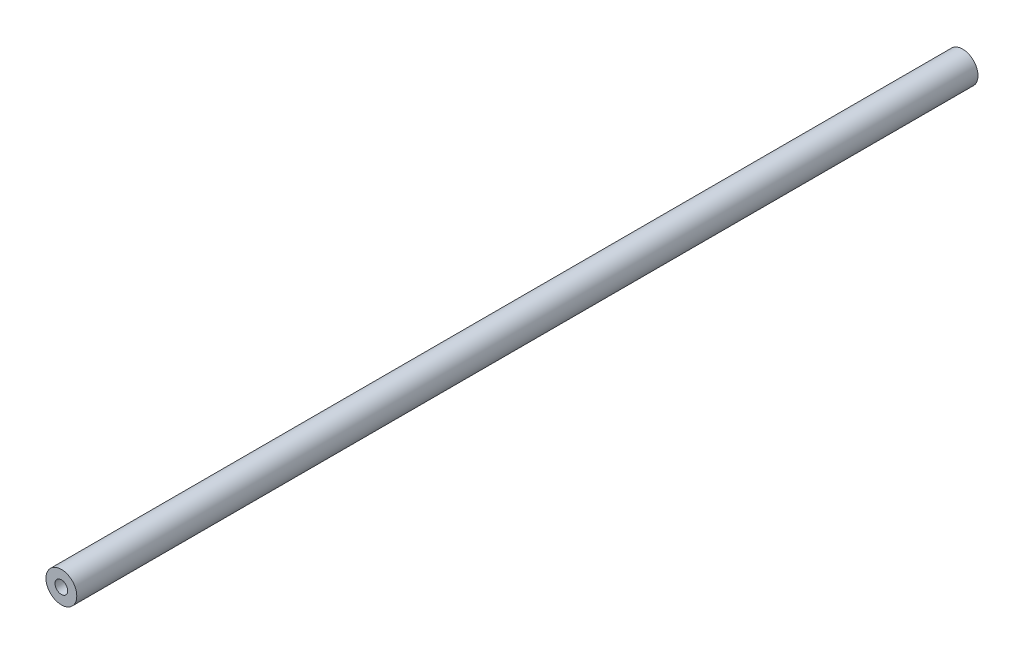
ISO-10303-21;
HEADER;
FILE_DESCRIPTION(('STEP AP214'),'2;1');
FILE_NAME('part.step','',(''),(''),'','','');
FILE_SCHEMA(('AUTOMOTIVE_DESIGN { 1 0 10303 214 1 1 1 1 }'));
ENDSEC;
DATA;
#1=APPLICATION_CONTEXT('core data for automotive mechanical design processes');
#2=APPLICATION_PROTOCOL_DEFINITION('international standard','automotive_design',2000,#1);
#3=PRODUCT_CONTEXT('',#1,'mechanical');
#4=PRODUCT('Part','Part','',(#3));
#5=PRODUCT_RELATED_PRODUCT_CATEGORY('part','',(#4));
#6=PRODUCT_DEFINITION_FORMATION('','',#4);
#7=PRODUCT_DEFINITION_CONTEXT('part definition',#1,'design');
#8=PRODUCT_DEFINITION('design','',#6,#7);
#9=PRODUCT_DEFINITION_SHAPE('','',#8);
#10=(LENGTH_UNIT() NAMED_UNIT(*) SI_UNIT(.MILLI.,.METRE.));
#11=(NAMED_UNIT(*) PLANE_ANGLE_UNIT() SI_UNIT($,.RADIAN.));
#12=(NAMED_UNIT(*) SI_UNIT($,.STERADIAN.) SOLID_ANGLE_UNIT());
#13=UNCERTAINTY_MEASURE_WITH_UNIT(LENGTH_MEASURE(1.E-05),#10,'distance_accuracy_value','');
#14=(GEOMETRIC_REPRESENTATION_CONTEXT(3) GLOBAL_UNCERTAINTY_ASSIGNED_CONTEXT((#13)) GLOBAL_UNIT_ASSIGNED_CONTEXT((#10,
#11,#12)) REPRESENTATION_CONTEXT('',''));
#15=CARTESIAN_POINT('',(0.,0.,0.));
#16=DIRECTION('',(0.,0.,1.));
#17=DIRECTION('',(1.,0.,0.));
#18=AXIS2_PLACEMENT_3D('',#15,#16,#17);
#19=CARTESIAN_POINT('',(0.,0.,234.));
#20=DIRECTION('',(0.,0.,-1.));
#21=DIRECTION('',(-1.,0.,0.));
#22=AXIS2_PLACEMENT_3D('',#19,#20,#21);
#23=CYLINDRICAL_SURFACE('',#22,4.);
#24=CARTESIAN_POINT('',(0.,0.,234.));
#25=DIRECTION('',(0.,0.,1.));
#26=DIRECTION('',(1.,0.,0.));
#27=AXIS2_PLACEMENT_3D('',#24,#25,#26);
#28=CIRCLE('',#27,4.);
#29=CARTESIAN_POINT('',(4.,0.,234.));
#30=VERTEX_POINT('',#29);
#31=EDGE_CURVE('E10',#30,#30,#28,.T.);
#32=ORIENTED_EDGE('',*,*,#31,.F.);
#33=EDGE_LOOP('',(#32));
#34=FACE_BOUND('',#33,.T.);
#35=CARTESIAN_POINT('',(0.,0.,0.));
#36=DIRECTION('',(0.,0.,1.));
#37=DIRECTION('',(1.,0.,0.));
#38=AXIS2_PLACEMENT_3D('',#35,#36,#37);
#39=CIRCLE('',#38,4.);
#40=CARTESIAN_POINT('',(4.,0.,0.));
#41=VERTEX_POINT('',#40);
#42=EDGE_CURVE('E40',#41,#41,#39,.T.);
#43=ORIENTED_EDGE('',*,*,#42,.T.);
#44=EDGE_LOOP('',(#43));
#45=FACE_BOUND('',#44,.T.);
#46=ADVANCED_FACE('F37',(#34,#45),#23,.T.);
#47=CARTESIAN_POINT('',(0.,0.,234.));
#48=DIRECTION('',(0.,0.,1.));
#49=DIRECTION('',(1.,0.,0.));
#50=AXIS2_PLACEMENT_3D('',#47,#48,#49);
#51=PLANE('',#50);
#52=CARTESIAN_POINT('',(0.,0.,234.));
#53=DIRECTION('',(0.,0.,1.));
#54=DIRECTION('',(1.,0.,0.));
#55=AXIS2_PLACEMENT_3D('',#52,#53,#54);
#56=CIRCLE('',#55,1.65);
#57=CARTESIAN_POINT('',(1.65,0.,234.));
#58=VERTEX_POINT('',#57);
#59=EDGE_CURVE('E51',#58,#58,#56,.T.);
#60=ORIENTED_EDGE('',*,*,#59,.F.);
#61=EDGE_LOOP('',(#60));
#62=FACE_BOUND('',#61,.T.);
#63=ORIENTED_EDGE('',*,*,#31,.T.);
#64=EDGE_LOOP('',(#63));
#65=FACE_BOUND('',#64,.T.);
#66=ADVANCED_FACE('F80',(#62,#65),#51,.T.);
#67=CARTESIAN_POINT('',(0.,0.,0.));
#68=DIRECTION('',(0.,0.,1.));
#69=DIRECTION('',(1.,0.,0.));
#70=AXIS2_PLACEMENT_3D('',#67,#68,#69);
#71=PLANE('',#70);
#72=CARTESIAN_POINT('',(0.,0.,0.));
#73=DIRECTION('',(0.,0.,-1.));
#74=DIRECTION('',(-1.,0.,0.));
#75=AXIS2_PLACEMENT_3D('',#72,#73,#74);
#76=CIRCLE('',#75,1.65);
#77=CARTESIAN_POINT('',(-1.65,0.,0.));
#78=VERTEX_POINT('',#77);
#79=EDGE_CURVE('E59',#78,#78,#76,.T.);
#80=ORIENTED_EDGE('',*,*,#79,.F.);
#81=EDGE_LOOP('',(#80));
#82=FACE_BOUND('',#81,.T.);
#83=ORIENTED_EDGE('',*,*,#42,.F.);
#84=EDGE_LOOP('',(#83));
#85=FACE_BOUND('',#84,.T.);
#86=ADVANCED_FACE('F76',(#82,#85),#71,.F.);
#87=CARTESIAN_POINT('',(0.,0.,219.));
#88=DIRECTION('',(0.,0.,1.));
#89=DIRECTION('',(1.,0.,0.));
#90=AXIS2_PLACEMENT_3D('',#87,#88,#89);
#91=CYLINDRICAL_SURFACE('',#90,1.65);
#92=CARTESIAN_POINT('',(0.,0.,219.));
#93=DIRECTION('',(0.,0.,1.));
#94=DIRECTION('',(1.,0.,0.));
#95=AXIS2_PLACEMENT_3D('',#92,#93,#94);
#96=CIRCLE('',#95,1.65);
#97=CARTESIAN_POINT('',(1.65,0.,219.));
#98=VERTEX_POINT('',#97);
#99=EDGE_CURVE('E49',#98,#98,#96,.T.);
#100=ORIENTED_EDGE('',*,*,#99,.F.);
#101=EDGE_LOOP('',(#100));
#102=FACE_BOUND('',#101,.T.);
#103=ORIENTED_EDGE('',*,*,#59,.T.);
#104=EDGE_LOOP('',(#103));
#105=FACE_BOUND('',#104,.T.);
#106=ADVANCED_FACE('F79',(#102,#105),#91,.F.);
#107=CARTESIAN_POINT('',(0.,0.,219.));
#108=DIRECTION('',(0.,0.,1.));
#109=DIRECTION('',(1.,0.,0.));
#110=AXIS2_PLACEMENT_3D('',#107,#108,#109);
#111=PLANE('',#110);
#112=ORIENTED_EDGE('',*,*,#99,.T.);
#113=EDGE_LOOP('',(#112));
#114=FACE_BOUND('',#113,.T.);
#115=ADVANCED_FACE('F72',(#114),#111,.T.);
#116=CARTESIAN_POINT('',(0.,0.,15.));
#117=DIRECTION('',(0.,0.,-1.));
#118=DIRECTION('',(-1.,0.,0.));
#119=AXIS2_PLACEMENT_3D('',#116,#117,#118);
#120=CYLINDRICAL_SURFACE('',#119,1.65);
#121=CARTESIAN_POINT('',(0.,0.,15.));
#122=DIRECTION('',(0.,0.,-1.));
#123=DIRECTION('',(-1.,0.,0.));
#124=AXIS2_PLACEMENT_3D('',#121,#122,#123);
#125=CIRCLE('',#124,1.65);
#126=CARTESIAN_POINT('',(-1.65,0.,15.));
#127=VERTEX_POINT('',#126);
#128=EDGE_CURVE('E55',#127,#127,#125,.T.);
#129=ORIENTED_EDGE('',*,*,#128,.F.);
#130=EDGE_LOOP('',(#129));
#131=FACE_BOUND('',#130,.T.);
#132=ORIENTED_EDGE('',*,*,#79,.T.);
#133=EDGE_LOOP('',(#132));
#134=FACE_BOUND('',#133,.T.);
#135=ADVANCED_FACE('F69',(#131,#134),#120,.F.);
#136=CARTESIAN_POINT('',(0.,0.,15.));
#137=DIRECTION('',(0.,0.,-1.));
#138=DIRECTION('',(-1.,0.,0.));
#139=AXIS2_PLACEMENT_3D('',#136,#137,#138);
#140=PLANE('',#139);
#141=ORIENTED_EDGE('',*,*,#128,.T.);
#142=EDGE_LOOP('',(#141));
#143=FACE_BOUND('',#142,.T.);
#144=ADVANCED_FACE('F67',(#143),#140,.T.);
#145=CLOSED_SHELL('',(#46,#66,#86,#106,#115,#135,#144));
#146=MANIFOLD_SOLID_BREP('B2',#145);
#147=ADVANCED_BREP_SHAPE_REPRESENTATION('',(#18,#146),#14);
#148=SHAPE_DEFINITION_REPRESENTATION(#9,#147);
ENDSEC;
END-ISO-10303-21;
